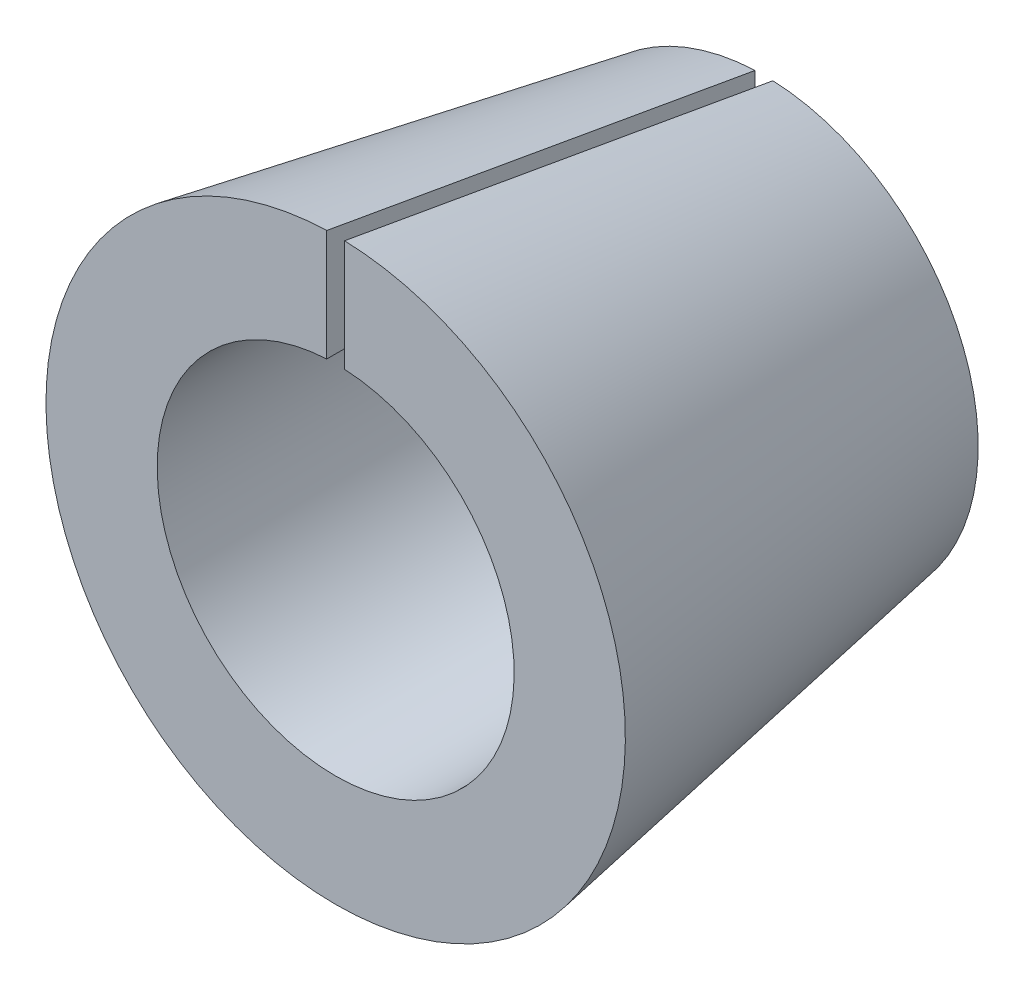
ISO-10303-21;
HEADER;
FILE_DESCRIPTION(('STEP AP214'),'2;1');
FILE_NAME('part.step','',(''),(''),'','','');
FILE_SCHEMA(('AUTOMOTIVE_DESIGN { 1 0 10303 214 1 1 1 1 }'));
ENDSEC;
DATA;
#1=APPLICATION_CONTEXT('core data for automotive mechanical design processes');
#2=APPLICATION_PROTOCOL_DEFINITION('international standard','automotive_design',2000,#1);
#3=PRODUCT_CONTEXT('',#1,'mechanical');
#4=PRODUCT('Part','Part','',(#3));
#5=PRODUCT_RELATED_PRODUCT_CATEGORY('part','',(#4));
#6=PRODUCT_DEFINITION_FORMATION('','',#4);
#7=PRODUCT_DEFINITION_CONTEXT('part definition',#1,'design');
#8=PRODUCT_DEFINITION('design','',#6,#7);
#9=PRODUCT_DEFINITION_SHAPE('','',#8);
#10=(LENGTH_UNIT() NAMED_UNIT(*) SI_UNIT(.MILLI.,.METRE.));
#11=(NAMED_UNIT(*) PLANE_ANGLE_UNIT() SI_UNIT($,.RADIAN.));
#12=(NAMED_UNIT(*) SI_UNIT($,.STERADIAN.) SOLID_ANGLE_UNIT());
#13=UNCERTAINTY_MEASURE_WITH_UNIT(LENGTH_MEASURE(1.E-05),#10,'distance_accuracy_value','');
#14=(GEOMETRIC_REPRESENTATION_CONTEXT(3) GLOBAL_UNCERTAINTY_ASSIGNED_CONTEXT((#13)) GLOBAL_UNIT_ASSIGNED_CONTEXT((#10,
#11,#12)) REPRESENTATION_CONTEXT('',''));
#15=CARTESIAN_POINT('',(0.,0.,0.));
#16=DIRECTION('',(0.,0.,1.));
#17=DIRECTION('',(1.,0.,0.));
#18=AXIS2_PLACEMENT_3D('',#15,#16,#17);
#19=CARTESIAN_POINT('',(0.,0.,-12.));
#20=DIRECTION('',(0.,0.,1.));
#21=DIRECTION('',(1.,0.,0.));
#22=AXIS2_PLACEMENT_3D('',#19,#20,#21);
#23=CONICAL_SURFACE('',#22,6.,0.174532925199426);
#24=CARTESIAN_POINT('',(-0.250000000000001,4.40005426819259,-21.0334971024176));
#25=CARTESIAN_POINT('',(-0.250000000000001,4.83543029501715,-18.5682557082927));
#26=CARTESIAN_POINT('',(-0.250000000000001,5.27064085337431,-16.1029851021516));
#27=CARTESIAN_POINT('',(-0.250000000000001,5.88861503115294,-12.6016452037885));
#28=CARTESIAN_POINT('',(-0.250000000000001,6.07145767648916,-11.5655898598363));
#29=CARTESIAN_POINT('',(-0.250000000000001,6.87216556500559,-7.02817539808651));
#30=CARTESIAN_POINT('',(-0.250000000000001,7.48990791231682,-3.52679459383115));
#31=CARTESIAN_POINT('',(-0.250000000000002,8.91646705240035,4.55978245099033));
#32=CARTESIAN_POINT('',(-0.250000000000002,9.72524146677257,9.14498616688587));
#33=CARTESIAN_POINT('',(-0.250000000000002,11.3426829067233,18.3154125304643));
#34=CARTESIAN_POINT('',(-0.250000000000003,12.151349932302,22.9006351781471));
#35=CARTESIAN_POINT('',(-0.250000000000003,12.960011229907,27.4858588345622));
#36=B_SPLINE_CURVE_WITH_KNOTS('',3,(#24,#25,#26,#27,#28,#29,#30,#31,#32,#33,#34,#35),
.UNSPECIFIED.,.F.,.F.,(4,2,2,2,2,4),(0.,7.51017353125564,10.666370447562,21.3327408782712,
35.3007000168488,49.2686591276993),.UNSPECIFIED.);
#37=CARTESIAN_POINT('',(-0.250000000000001,8.11207239958615,0.));
#38=VERTEX_POINT('',#37);
#39=CARTESIAN_POINT('',(-0.250000000000001,5.9947894041409,-12.));
#40=VERTEX_POINT('',#39);
#41=EDGE_CURVE('E99',#38,#40,#36,.F.);
#42=ORIENTED_EDGE('',*,*,#41,.T.);
#43=CARTESIAN_POINT('',(0.,0.,-12.));
#44=DIRECTION('',(0.,0.,-1.));
#45=DIRECTION('',(-1.,0.,0.));
#46=AXIS2_PLACEMENT_3D('',#43,#44,#45);
#47=CIRCLE('',#46,6.);
#48=CARTESIAN_POINT('',(0.249999999999999,5.9947894041409,-12.));
#49=VERTEX_POINT('',#48);
#50=EDGE_CURVE('E80',#49,#40,#47,.T.);
#51=ORIENTED_EDGE('',*,*,#50,.F.);
#52=CARTESIAN_POINT('',(0.249999999999999,4.40005426822848,-21.0334971022145));
#53=CARTESIAN_POINT('',(0.249999999999999,4.83543029505656,-18.5682557080695));
#54=CARTESIAN_POINT('',(0.249999999999999,5.27064085341724,-16.1029851019084));
#55=CARTESIAN_POINT('',(0.249999999999999,5.88861503118392,-12.601645203613));
#56=CARTESIAN_POINT('',(0.249999999999999,6.07145767650466,-11.5655898597484));
#57=CARTESIAN_POINT('',(0.249999999999999,6.87216556499365,-7.02817539815416));
#58=CARTESIAN_POINT('',(0.249999999999999,7.48990791229293,-3.52679459396655));
#59=CARTESIAN_POINT('',(0.249999999999998,8.91646705236451,4.55978245078716));
#60=CARTESIAN_POINT('',(0.249999999999998,9.72524146673673,9.14498616668271));
#61=CARTESIAN_POINT('',(0.249999999999998,11.3426829066875,18.3154125302611));
#62=CARTESIAN_POINT('',(0.249999999999998,12.1513499322662,22.9006351779439));
#63=CARTESIAN_POINT('',(0.249999999999998,12.9600112298712,27.485858834359));
#64=B_SPLINE_CURVE_WITH_KNOTS('',3,(#52,#53,#54,#55,#56,#57,#58,#59,#60,#61,#62,#63),
.UNSPECIFIED.,.F.,.F.,(4,2,2,2,2,4),(0.,7.51017353131668,10.6663704473558,21.3327408778586,
35.3007000164362,49.2686591272867),.UNSPECIFIED.);
#65=CARTESIAN_POINT('',(0.249999999999999,8.11207239958615,0.));
#66=VERTEX_POINT('',#65);
#67=EDGE_CURVE('E56',#49,#66,#64,.T.);
#68=ORIENTED_EDGE('',*,*,#67,.T.);
#69=CARTESIAN_POINT('',(0.,0.,0.));
#70=DIRECTION('',(0.,0.,-1.));
#71=DIRECTION('',(-1.,0.,0.));
#72=AXIS2_PLACEMENT_3D('',#69,#70,#71);
#73=CIRCLE('',#72,8.11592376850149);
#74=EDGE_CURVE('E11',#66,#38,#73,.T.);
#75=ORIENTED_EDGE('',*,*,#74,.T.);
#76=EDGE_LOOP('',(#42,#51,#68,#75));
#77=FACE_BOUND('',#76,.T.);
#78=ADVANCED_FACE('F34',(#77),#23,.T.);
#79=CARTESIAN_POINT('',(0.,8.11592376850149,0.));
#80=DIRECTION('',(0.,0.,1.));
#81=DIRECTION('',(1.,0.,0.));
#82=AXIS2_PLACEMENT_3D('',#79,#80,#81);
#83=PLANE('',#82);
#84=DIRECTION('',(0.,-1.,0.));
#85=VECTOR('',#84,1.);
#86=CARTESIAN_POINT('',(-0.250000000000002,8.11592376850149,0.));
#87=LINE('',#86,#85);
#88=CARTESIAN_POINT('',(-0.250000000000001,4.99374608885954,0.));
#89=VERTEX_POINT('',#88);
#90=EDGE_CURVE('E96',#38,#89,#87,.T.);
#91=ORIENTED_EDGE('',*,*,#90,.F.);
#92=ORIENTED_EDGE('',*,*,#74,.F.);
#93=DIRECTION('',(0.,1.,0.));
#94=VECTOR('',#93,1.);
#95=CARTESIAN_POINT('',(0.249999999999999,8.11592376850149,0.));
#96=LINE('',#95,#94);
#97=CARTESIAN_POINT('',(0.249999999999999,4.99374608885954,0.));
#98=VERTEX_POINT('',#97);
#99=EDGE_CURVE('E81',#98,#66,#96,.T.);
#100=ORIENTED_EDGE('',*,*,#99,.F.);
#101=CARTESIAN_POINT('',(0.,0.,0.));
#102=DIRECTION('',(0.,0.,-1.));
#103=DIRECTION('',(-1.,0.,0.));
#104=AXIS2_PLACEMENT_3D('',#101,#102,#103);
#105=CIRCLE('',#104,5.);
#106=EDGE_CURVE('E41',#98,#89,#105,.T.);
#107=ORIENTED_EDGE('',*,*,#106,.T.);
#108=EDGE_LOOP('',(#91,#92,#100,#107));
#109=FACE_BOUND('',#108,.T.);
#110=ADVANCED_FACE('F121',(#109),#83,.T.);
#111=CARTESIAN_POINT('',(0.,0.,-14.1891320444003));
#112=DIRECTION('',(0.,0.,-1.));
#113=DIRECTION('',(-1.,0.,0.));
#114=AXIS2_PLACEMENT_3D('',#111,#112,#113);
#115=CYLINDRICAL_SURFACE('',#114,5.);
#116=DIRECTION('',(0.,0.,-1.));
#117=VECTOR('',#116,1.);
#118=CARTESIAN_POINT('',(-0.250000000000001,4.99374608885954,-14.1891320444003));
#119=LINE('',#118,#117);
#120=CARTESIAN_POINT('',(-0.250000000000001,4.99374608885955,-12.));
#121=VERTEX_POINT('',#120);
#122=EDGE_CURVE('E48',#121,#89,#119,.F.);
#123=ORIENTED_EDGE('',*,*,#122,.T.);
#124=ORIENTED_EDGE('',*,*,#106,.F.);
#125=DIRECTION('',(0.,0.,-1.));
#126=VECTOR('',#125,1.);
#127=CARTESIAN_POINT('',(0.249999999999999,4.99374608885954,-14.1891320444003));
#128=LINE('',#127,#126);
#129=CARTESIAN_POINT('',(0.249999999999999,4.99374608885955,-12.));
#130=VERTEX_POINT('',#129);
#131=EDGE_CURVE('E74',#98,#130,#128,.T.);
#132=ORIENTED_EDGE('',*,*,#131,.T.);
#133=CARTESIAN_POINT('',(0.,0.,-12.));
#134=DIRECTION('',(0.,0.,-1.));
#135=DIRECTION('',(-1.,0.,0.));
#136=AXIS2_PLACEMENT_3D('',#133,#134,#135);
#137=CIRCLE('',#136,5.);
#138=EDGE_CURVE('E87',#130,#121,#137,.T.);
#139=ORIENTED_EDGE('',*,*,#138,.T.);
#140=EDGE_LOOP('',(#123,#124,#132,#139));
#141=FACE_BOUND('',#140,.T.);
#142=ADVANCED_FACE('F86',(#141),#115,.F.);
#143=CARTESIAN_POINT('',(0.,5.,-12.));
#144=DIRECTION('',(0.,0.,-1.));
#145=DIRECTION('',(-1.,0.,0.));
#146=AXIS2_PLACEMENT_3D('',#143,#144,#145);
#147=PLANE('',#146);
#148=DIRECTION('',(0.,-1.,0.));
#149=VECTOR('',#148,1.);
#150=CARTESIAN_POINT('',(-0.250000000000002,8.11592376850149,-12.));
#151=LINE('',#150,#149);
#152=EDGE_CURVE('E91',#40,#121,#151,.T.);
#153=ORIENTED_EDGE('',*,*,#152,.T.);
#154=ORIENTED_EDGE('',*,*,#138,.F.);
#155=DIRECTION('',(0.,1.,0.));
#156=VECTOR('',#155,1.);
#157=CARTESIAN_POINT('',(0.249999999999999,8.11592376850149,-12.));
#158=LINE('',#157,#156);
#159=EDGE_CURVE('E71',#130,#49,#158,.T.);
#160=ORIENTED_EDGE('',*,*,#159,.T.);
#161=ORIENTED_EDGE('',*,*,#50,.T.);
#162=EDGE_LOOP('',(#153,#154,#160,#161));
#163=FACE_BOUND('',#162,.T.);
#164=ADVANCED_FACE('F90',(#163),#147,.T.);
#165=CARTESIAN_POINT('',(0.249999999999999,8.11592376850149,-12.001));
#166=DIRECTION('',(1.,0.,0.));
#167=DIRECTION('',(0.,1.,0.));
#168=AXIS2_PLACEMENT_3D('',#165,#166,#167);
#169=PLANE('',#168);
#170=ORIENTED_EDGE('',*,*,#159,.F.);
#171=ORIENTED_EDGE('',*,*,#131,.F.);
#172=ORIENTED_EDGE('',*,*,#99,.T.);
#173=ORIENTED_EDGE('',*,*,#67,.F.);
#174=EDGE_LOOP('',(#170,#171,#172,#173));
#175=FACE_BOUND('',#174,.T.);
#176=ADVANCED_FACE('F73',(#175),#169,.F.);
#177=CARTESIAN_POINT('',(-0.250000000000002,8.11592376850149,-12.001));
#178=DIRECTION('',(-1.,0.,0.));
#179=DIRECTION('',(0.,-1.,0.));
#180=AXIS2_PLACEMENT_3D('',#177,#178,#179);
#181=PLANE('',#180);
#182=ORIENTED_EDGE('',*,*,#90,.T.);
#183=ORIENTED_EDGE('',*,*,#122,.F.);
#184=ORIENTED_EDGE('',*,*,#152,.F.);
#185=ORIENTED_EDGE('',*,*,#41,.F.);
#186=EDGE_LOOP('',(#182,#183,#184,#185));
#187=FACE_BOUND('',#186,.T.);
#188=ADVANCED_FACE('F113',(#187),#181,.F.);
#189=CLOSED_SHELL('',(#78,#110,#142,#164,#176,#188));
#190=MANIFOLD_SOLID_BREP('B2',#189);
#191=ADVANCED_BREP_SHAPE_REPRESENTATION('',(#18,#190),#14);
#192=SHAPE_DEFINITION_REPRESENTATION(#9,#191);
ENDSEC;
END-ISO-10303-21;
